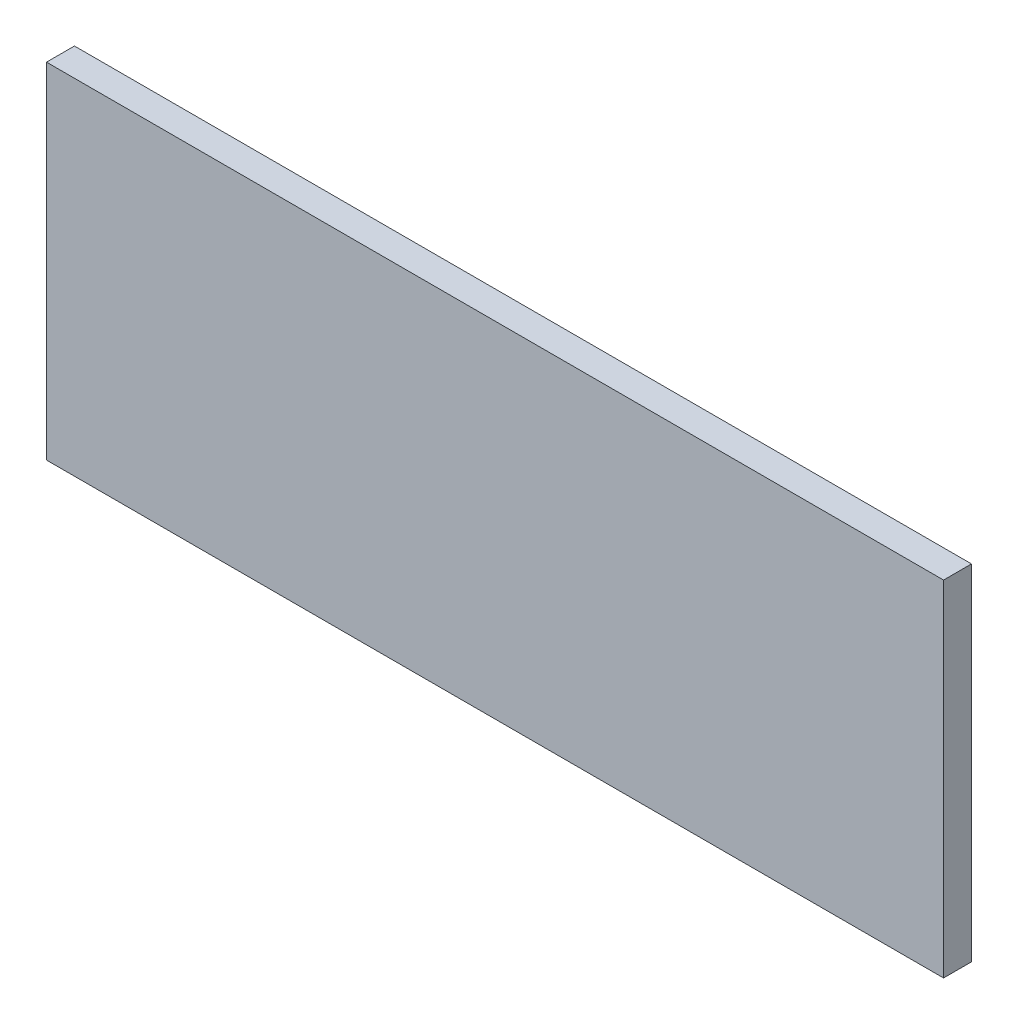
ISO-10303-21;
HEADER;
FILE_DESCRIPTION(('STEP AP214'),'2;1');
FILE_NAME('part.step','',(''),(''),'','','');
FILE_SCHEMA(('AUTOMOTIVE_DESIGN { 1 0 10303 214 1 1 1 1 }'));
ENDSEC;
DATA;
#1=APPLICATION_CONTEXT('core data for automotive mechanical design processes');
#2=APPLICATION_PROTOCOL_DEFINITION('international standard','automotive_design',2000,#1);
#3=PRODUCT_CONTEXT('',#1,'mechanical');
#4=PRODUCT('Part','Part','',(#3));
#5=PRODUCT_RELATED_PRODUCT_CATEGORY('part','',(#4));
#6=PRODUCT_DEFINITION_FORMATION('','',#4);
#7=PRODUCT_DEFINITION_CONTEXT('part definition',#1,'design');
#8=PRODUCT_DEFINITION('design','',#6,#7);
#9=PRODUCT_DEFINITION_SHAPE('','',#8);
#10=(LENGTH_UNIT() NAMED_UNIT(*) SI_UNIT(.MILLI.,.METRE.));
#11=(NAMED_UNIT(*) PLANE_ANGLE_UNIT() SI_UNIT($,.RADIAN.));
#12=(NAMED_UNIT(*) SI_UNIT($,.STERADIAN.) SOLID_ANGLE_UNIT());
#13=UNCERTAINTY_MEASURE_WITH_UNIT(LENGTH_MEASURE(1.E-05),#10,'distance_accuracy_value','');
#14=(GEOMETRIC_REPRESENTATION_CONTEXT(3) GLOBAL_UNCERTAINTY_ASSIGNED_CONTEXT((#13)) GLOBAL_UNIT_ASSIGNED_CONTEXT((#10,
#11,#12)) REPRESENTATION_CONTEXT('',''));
#15=CARTESIAN_POINT('',(0.,0.,0.));
#16=DIRECTION('',(0.,0.,1.));
#17=DIRECTION('',(1.,0.,0.));
#18=AXIS2_PLACEMENT_3D('',#15,#16,#17);
#19=CARTESIAN_POINT('',(-24.8449643468249,6.99858150614786,2.));
#20=DIRECTION('',(1.,0.,0.));
#21=DIRECTION('',(0.,0.,-1.));
#22=AXIS2_PLACEMENT_3D('',#19,#20,#21);
#23=PLANE('',#22);
#24=DIRECTION('',(0.,-1.,0.));
#25=VECTOR('',#24,1.);
#26=CARTESIAN_POINT('',(-24.8449643468249,6.99858150614786,0.));
#27=LINE('',#26,#25);
#28=CARTESIAN_POINT('',(-24.8449643468249,31.6685813153191,0.));
#29=VERTEX_POINT('',#28);
#30=CARTESIAN_POINT('',(-24.8449643468249,6.99858150614786,0.));
#31=VERTEX_POINT('',#30);
#32=EDGE_CURVE('E107',#29,#31,#27,.T.);
#33=ORIENTED_EDGE('',*,*,#32,.T.);
#34=DIRECTION('',(0.,0.,-1.));
#35=VECTOR('',#34,1.);
#36=CARTESIAN_POINT('',(-24.8449643468249,6.99858150614786,2.));
#37=LINE('',#36,#35);
#38=CARTESIAN_POINT('',(-24.8449643468249,6.99858150614786,2.));
#39=VERTEX_POINT('',#38);
#40=EDGE_CURVE('E11',#39,#31,#37,.T.);
#41=ORIENTED_EDGE('',*,*,#40,.F.);
#42=DIRECTION('',(0.,-1.,0.));
#43=VECTOR('',#42,1.);
#44=CARTESIAN_POINT('',(-24.8449643468249,6.99858150614786,2.));
#45=LINE('',#44,#43);
#46=CARTESIAN_POINT('',(-24.8449643468249,31.6685813153191,2.));
#47=VERTEX_POINT('',#46);
#48=EDGE_CURVE('E91',#47,#39,#45,.T.);
#49=ORIENTED_EDGE('',*,*,#48,.F.);
#50=DIRECTION('',(0.,0.,-1.));
#51=VECTOR('',#50,1.);
#52=CARTESIAN_POINT('',(-24.8449643468249,31.6685813153191,2.));
#53=LINE('',#52,#51);
#54=EDGE_CURVE('E103',#47,#29,#53,.T.);
#55=ORIENTED_EDGE('',*,*,#54,.T.);
#56=EDGE_LOOP('',(#33,#41,#49,#55));
#57=FACE_BOUND('',#56,.T.);
#58=ADVANCED_FACE('F39',(#57),#23,.F.);
#59=CARTESIAN_POINT('',(-24.8449643468249,6.99858150614786,2.));
#60=DIRECTION('',(0.,1.,0.));
#61=DIRECTION('',(0.,0.,1.));
#62=AXIS2_PLACEMENT_3D('',#59,#60,#61);
#63=PLANE('',#62);
#64=DIRECTION('',(1.,0.,0.));
#65=VECTOR('',#64,1.);
#66=CARTESIAN_POINT('',(-24.8449643468249,6.99858150614786,0.));
#67=LINE('',#66,#65);
#68=CARTESIAN_POINT('',(39.3670209720818,6.99858150614786,0.));
#69=VERTEX_POINT('',#68);
#70=EDGE_CURVE('E96',#31,#69,#67,.T.);
#71=ORIENTED_EDGE('',*,*,#70,.T.);
#72=DIRECTION('',(0.,0.,-1.));
#73=VECTOR('',#72,1.);
#74=CARTESIAN_POINT('',(39.3670209720818,6.99858150614786,2.));
#75=LINE('',#74,#73);
#76=CARTESIAN_POINT('',(39.3670209720818,6.99858150614786,2.));
#77=VERTEX_POINT('',#76);
#78=EDGE_CURVE('E48',#77,#69,#75,.T.);
#79=ORIENTED_EDGE('',*,*,#78,.F.);
#80=DIRECTION('',(1.,0.,0.));
#81=VECTOR('',#80,1.);
#82=CARTESIAN_POINT('',(-24.8449643468249,6.99858150614786,2.));
#83=LINE('',#82,#81);
#84=EDGE_CURVE('E86',#39,#77,#83,.T.);
#85=ORIENTED_EDGE('',*,*,#84,.F.);
#86=ORIENTED_EDGE('',*,*,#40,.T.);
#87=EDGE_LOOP('',(#71,#79,#85,#86));
#88=FACE_BOUND('',#87,.T.);
#89=ADVANCED_FACE('F95',(#88),#63,.F.);
#90=CARTESIAN_POINT('',(39.3670209720818,6.99858150614786,2.));
#91=DIRECTION('',(-1.,0.,0.));
#92=DIRECTION('',(0.,0.,1.));
#93=AXIS2_PLACEMENT_3D('',#90,#91,#92);
#94=PLANE('',#93);
#95=DIRECTION('',(0.,1.,0.));
#96=VECTOR('',#95,1.);
#97=CARTESIAN_POINT('',(39.3670209720818,6.99858150614786,0.));
#98=LINE('',#97,#96);
#99=CARTESIAN_POINT('',(39.3670209720818,31.6685813153191,0.));
#100=VERTEX_POINT('',#99);
#101=EDGE_CURVE('E73',#69,#100,#98,.T.);
#102=ORIENTED_EDGE('',*,*,#101,.T.);
#103=DIRECTION('',(0.,0.,-1.));
#104=VECTOR('',#103,1.);
#105=CARTESIAN_POINT('',(39.3670209720818,31.6685813153191,2.));
#106=LINE('',#105,#104);
#107=CARTESIAN_POINT('',(39.3670209720818,31.6685813153191,2.));
#108=VERTEX_POINT('',#107);
#109=EDGE_CURVE('E98',#108,#100,#106,.T.);
#110=ORIENTED_EDGE('',*,*,#109,.F.);
#111=DIRECTION('',(0.,1.,0.));
#112=VECTOR('',#111,1.);
#113=CARTESIAN_POINT('',(39.3670209720818,6.99858150614786,2.));
#114=LINE('',#113,#112);
#115=EDGE_CURVE('E89',#77,#108,#114,.T.);
#116=ORIENTED_EDGE('',*,*,#115,.F.);
#117=ORIENTED_EDGE('',*,*,#78,.T.);
#118=EDGE_LOOP('',(#102,#110,#116,#117));
#119=FACE_BOUND('',#118,.T.);
#120=ADVANCED_FACE('F99',(#119),#94,.F.);
#121=CARTESIAN_POINT('',(-24.8449643468249,31.6685813153191,2.));
#122=DIRECTION('',(0.,-1.,0.));
#123=DIRECTION('',(0.,0.,-1.));
#124=AXIS2_PLACEMENT_3D('',#121,#122,#123);
#125=PLANE('',#124);
#126=DIRECTION('',(-1.,0.,0.));
#127=VECTOR('',#126,1.);
#128=CARTESIAN_POINT('',(-24.8449643468249,31.6685813153191,0.));
#129=LINE('',#128,#127);
#130=EDGE_CURVE('E79',#100,#29,#129,.T.);
#131=ORIENTED_EDGE('',*,*,#130,.T.);
#132=ORIENTED_EDGE('',*,*,#54,.F.);
#133=DIRECTION('',(-1.,0.,0.));
#134=VECTOR('',#133,1.);
#135=CARTESIAN_POINT('',(-24.8449643468249,31.6685813153191,2.));
#136=LINE('',#135,#134);
#137=EDGE_CURVE('E56',#108,#47,#136,.T.);
#138=ORIENTED_EDGE('',*,*,#137,.F.);
#139=ORIENTED_EDGE('',*,*,#109,.T.);
#140=EDGE_LOOP('',(#131,#132,#138,#139));
#141=FACE_BOUND('',#140,.T.);
#142=ADVANCED_FACE('F120',(#141),#125,.F.);
#143=CARTESIAN_POINT('',(0.,0.,2.));
#144=DIRECTION('',(0.,0.,-1.));
#145=DIRECTION('',(-1.,0.,0.));
#146=AXIS2_PLACEMENT_3D('',#143,#144,#145);
#147=PLANE('',#146);
#148=ORIENTED_EDGE('',*,*,#48,.T.);
#149=ORIENTED_EDGE('',*,*,#84,.T.);
#150=ORIENTED_EDGE('',*,*,#115,.T.);
#151=ORIENTED_EDGE('',*,*,#137,.T.);
#152=EDGE_LOOP('',(#148,#149,#150,#151));
#153=FACE_BOUND('',#152,.T.);
#154=ADVANCED_FACE('F87',(#153),#147,.F.);
#155=CARTESIAN_POINT('',(0.,0.,0.));
#156=DIRECTION('',(0.,0.,-1.));
#157=DIRECTION('',(-1.,0.,0.));
#158=AXIS2_PLACEMENT_3D('',#155,#156,#157);
#159=PLANE('',#158);
#160=ORIENTED_EDGE('',*,*,#32,.F.);
#161=ORIENTED_EDGE('',*,*,#130,.F.);
#162=ORIENTED_EDGE('',*,*,#101,.F.);
#163=ORIENTED_EDGE('',*,*,#70,.F.);
#164=EDGE_LOOP('',(#160,#161,#162,#163));
#165=FACE_BOUND('',#164,.T.);
#166=ADVANCED_FACE('F123',(#165),#159,.T.);
#167=CLOSED_SHELL('',(#58,#89,#120,#142,#154,#166));
#168=MANIFOLD_SOLID_BREP('B2',#167);
#169=ADVANCED_BREP_SHAPE_REPRESENTATION('',(#18,#168),#14);
#170=SHAPE_DEFINITION_REPRESENTATION(#9,#169);
ENDSEC;
END-ISO-10303-21;
